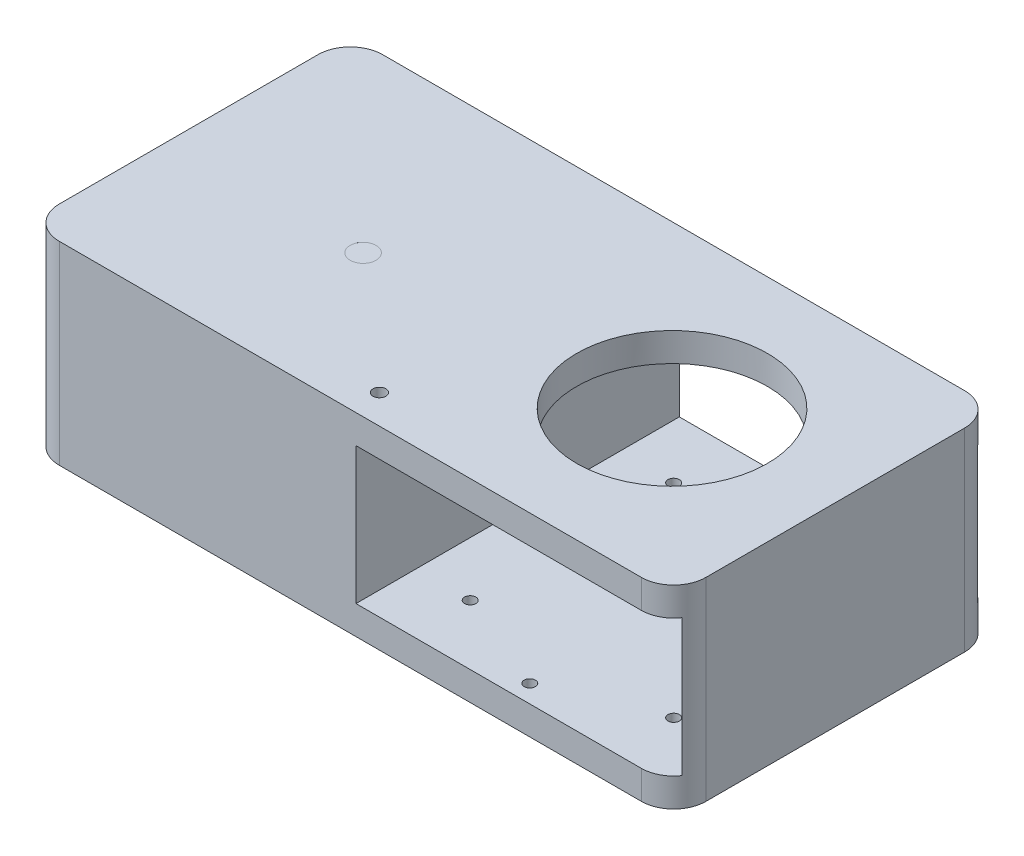
ISO-10303-21;
HEADER;
FILE_DESCRIPTION(('STEP AP214'),'2;1');
FILE_NAME('part.step','',(''),(''),'','','');
FILE_SCHEMA(('AUTOMOTIVE_DESIGN { 1 0 10303 214 1 1 1 1 }'));
ENDSEC;
DATA;
#1=APPLICATION_CONTEXT('core data for automotive mechanical design processes');
#2=APPLICATION_PROTOCOL_DEFINITION('international standard','automotive_design',2000,#1);
#3=PRODUCT_CONTEXT('',#1,'mechanical');
#4=PRODUCT('Part','Part','',(#3));
#5=PRODUCT_RELATED_PRODUCT_CATEGORY('part','',(#4));
#6=PRODUCT_DEFINITION_FORMATION('','',#4);
#7=PRODUCT_DEFINITION_CONTEXT('part definition',#1,'design');
#8=PRODUCT_DEFINITION('design','',#6,#7);
#9=PRODUCT_DEFINITION_SHAPE('','',#8);
#10=(LENGTH_UNIT() NAMED_UNIT(*) SI_UNIT(.MILLI.,.METRE.));
#11=(NAMED_UNIT(*) PLANE_ANGLE_UNIT() SI_UNIT($,.RADIAN.));
#12=(NAMED_UNIT(*) SI_UNIT($,.STERADIAN.) SOLID_ANGLE_UNIT());
#13=UNCERTAINTY_MEASURE_WITH_UNIT(LENGTH_MEASURE(1.E-05),#10,'distance_accuracy_value','');
#14=(GEOMETRIC_REPRESENTATION_CONTEXT(3) GLOBAL_UNCERTAINTY_ASSIGNED_CONTEXT((#13)) GLOBAL_UNIT_ASSIGNED_CONTEXT((#10,
#11,#12)) REPRESENTATION_CONTEXT('',''));
#15=CARTESIAN_POINT('',(0.,0.,0.));
#16=DIRECTION('',(0.,0.,1.));
#17=DIRECTION('',(1.,0.,0.));
#18=AXIS2_PLACEMENT_3D('',#15,#16,#17);
#19=CARTESIAN_POINT('',(90.,60.,-40.));
#20=DIRECTION('',(0.,1.,0.));
#21=DIRECTION('',(0.,0.,1.));
#22=AXIS2_PLACEMENT_3D('',#19,#20,#21);
#23=CYLINDRICAL_SURFACE('',#22,10.);
#24=DIRECTION('',(0.,1.,0.));
#25=VECTOR('',#24,1.);
#26=CARTESIAN_POINT('',(100.,60.,-40.));
#27=LINE('',#26,#25);
#28=CARTESIAN_POINT('',(100.,0.,-40.));
#29=VERTEX_POINT('',#28);
#30=CARTESIAN_POINT('',(100.,60.,-40.));
#31=VERTEX_POINT('',#30);
#32=EDGE_CURVE('E248',#29,#31,#27,.T.);
#33=ORIENTED_EDGE('',*,*,#32,.F.);
#34=CARTESIAN_POINT('',(90.,0.,-40.));
#35=DIRECTION('',(0.,1.,0.));
#36=DIRECTION('',(0.,0.,1.));
#37=AXIS2_PLACEMENT_3D('',#34,#35,#36);
#38=CIRCLE('',#37,10.);
#39=CARTESIAN_POINT('',(90.,0.,-50.));
#40=VERTEX_POINT('',#39);
#41=EDGE_CURVE('E44',#40,#29,#38,.F.);
#42=ORIENTED_EDGE('',*,*,#41,.F.);
#43=DIRECTION('',(0.,1.,0.));
#44=VECTOR('',#43,1.);
#45=CARTESIAN_POINT('',(90.,60.,-50.));
#46=LINE('',#45,#44);
#47=CARTESIAN_POINT('',(90.,8.85,-50.));
#48=VERTEX_POINT('',#47);
#49=EDGE_CURVE('E251',#48,#40,#46,.F.);
#50=ORIENTED_EDGE('',*,*,#49,.F.);
#51=CARTESIAN_POINT('',(90.,8.85,-40.));
#52=DIRECTION('',(0.,-1.,0.));
#53=DIRECTION('',(0.,0.,-1.));
#54=AXIS2_PLACEMENT_3D('',#51,#52,#53);
#55=CIRCLE('',#54,10.);
#56=CARTESIAN_POINT('',(98.25,8.85,-45.6513272777287));
#57=VERTEX_POINT('',#56);
#58=EDGE_CURVE('E51',#57,#48,#55,.F.);
#59=ORIENTED_EDGE('',*,*,#58,.F.);
#60=DIRECTION('',(0.,1.,0.));
#61=VECTOR('',#60,1.);
#62=CARTESIAN_POINT('',(98.25,60.,-45.6513272777287));
#63=LINE('',#62,#61);
#64=CARTESIAN_POINT('',(98.25,51.15,-45.6513272777287));
#65=VERTEX_POINT('',#64);
#66=EDGE_CURVE('E55',#65,#57,#63,.F.);
#67=ORIENTED_EDGE('',*,*,#66,.F.);
#68=CARTESIAN_POINT('',(90.,51.15,-40.));
#69=DIRECTION('',(0.,-1.,0.));
#70=DIRECTION('',(0.,0.,-1.));
#71=AXIS2_PLACEMENT_3D('',#68,#69,#70);
#72=CIRCLE('',#71,10.);
#73=CARTESIAN_POINT('',(90.,51.15,-50.));
#74=VERTEX_POINT('',#73);
#75=EDGE_CURVE('E255',#74,#65,#72,.T.);
#76=ORIENTED_EDGE('',*,*,#75,.F.);
#77=DIRECTION('',(0.,1.,0.));
#78=VECTOR('',#77,1.);
#79=CARTESIAN_POINT('',(90.,60.,-50.));
#80=LINE('',#79,#78);
#81=CARTESIAN_POINT('',(90.,60.,-50.));
#82=VERTEX_POINT('',#81);
#83=EDGE_CURVE('E253',#82,#74,#80,.F.);
#84=ORIENTED_EDGE('',*,*,#83,.F.);
#85=CARTESIAN_POINT('',(90.,60.,-40.));
#86=DIRECTION('',(0.,1.,0.));
#87=DIRECTION('',(0.,0.,1.));
#88=AXIS2_PLACEMENT_3D('',#85,#86,#87);
#89=CIRCLE('',#88,10.);
#90=EDGE_CURVE('E11',#31,#82,#89,.T.);
#91=ORIENTED_EDGE('',*,*,#90,.F.);
#92=EDGE_LOOP('',(#33,#42,#50,#59,#67,#76,#84,#91));
#93=FACE_BOUND('',#92,.T.);
#94=ADVANCED_FACE('F37',(#93),#23,.T.);
#95=CARTESIAN_POINT('',(90.,60.,40.));
#96=DIRECTION('',(0.,1.,0.));
#97=DIRECTION('',(0.,0.,1.));
#98=AXIS2_PLACEMENT_3D('',#95,#96,#97);
#99=CYLINDRICAL_SURFACE('',#98,10.);
#100=DIRECTION('',(0.,1.,0.));
#101=VECTOR('',#100,1.);
#102=CARTESIAN_POINT('',(90.,60.,50.));
#103=LINE('',#102,#101);
#104=CARTESIAN_POINT('',(90.,0.,50.));
#105=VERTEX_POINT('',#104);
#106=CARTESIAN_POINT('',(90.,8.85,50.));
#107=VERTEX_POINT('',#106);
#108=EDGE_CURVE('E230',#105,#107,#103,.T.);
#109=ORIENTED_EDGE('',*,*,#108,.F.);
#110=CARTESIAN_POINT('',(90.,0.,40.));
#111=DIRECTION('',(0.,1.,0.));
#112=DIRECTION('',(0.,0.,1.));
#113=AXIS2_PLACEMENT_3D('',#110,#111,#112);
#114=CIRCLE('',#113,10.);
#115=CARTESIAN_POINT('',(100.,0.,40.));
#116=VERTEX_POINT('',#115);
#117=EDGE_CURVE('E244',#116,#105,#114,.F.);
#118=ORIENTED_EDGE('',*,*,#117,.F.);
#119=DIRECTION('',(0.,1.,0.));
#120=VECTOR('',#119,1.);
#121=CARTESIAN_POINT('',(100.,60.,40.));
#122=LINE('',#121,#120);
#123=CARTESIAN_POINT('',(100.,60.,40.));
#124=VERTEX_POINT('',#123);
#125=EDGE_CURVE('E241',#124,#116,#122,.F.);
#126=ORIENTED_EDGE('',*,*,#125,.F.);
#127=CARTESIAN_POINT('',(90.,60.,40.));
#128=DIRECTION('',(0.,1.,0.));
#129=DIRECTION('',(0.,0.,1.));
#130=AXIS2_PLACEMENT_3D('',#127,#128,#129);
#131=CIRCLE('',#130,10.);
#132=CARTESIAN_POINT('',(90.,60.,50.));
#133=VERTEX_POINT('',#132);
#134=EDGE_CURVE('E246',#133,#124,#131,.T.);
#135=ORIENTED_EDGE('',*,*,#134,.F.);
#136=DIRECTION('',(0.,1.,0.));
#137=VECTOR('',#136,1.);
#138=CARTESIAN_POINT('',(90.,60.,50.));
#139=LINE('',#138,#137);
#140=CARTESIAN_POINT('',(90.,51.15,50.));
#141=VERTEX_POINT('',#140);
#142=EDGE_CURVE('E227',#141,#133,#139,.T.);
#143=ORIENTED_EDGE('',*,*,#142,.F.);
#144=CARTESIAN_POINT('',(90.,51.15,40.));
#145=DIRECTION('',(0.,-1.,0.));
#146=DIRECTION('',(0.,0.,-1.));
#147=AXIS2_PLACEMENT_3D('',#144,#145,#146);
#148=CIRCLE('',#147,10.);
#149=CARTESIAN_POINT('',(98.25,51.15,45.6513272777287));
#150=VERTEX_POINT('',#149);
#151=EDGE_CURVE('E239',#150,#141,#148,.T.);
#152=ORIENTED_EDGE('',*,*,#151,.F.);
#153=DIRECTION('',(0.,1.,0.));
#154=VECTOR('',#153,1.);
#155=CARTESIAN_POINT('',(98.25,60.,45.6513272777287));
#156=LINE('',#155,#154);
#157=CARTESIAN_POINT('',(98.25,8.85,45.6513272777287));
#158=VERTEX_POINT('',#157);
#159=EDGE_CURVE('E236',#158,#150,#156,.T.);
#160=ORIENTED_EDGE('',*,*,#159,.F.);
#161=CARTESIAN_POINT('',(90.,8.85,40.));
#162=DIRECTION('',(0.,-1.,0.));
#163=DIRECTION('',(0.,0.,-1.));
#164=AXIS2_PLACEMENT_3D('',#161,#162,#163);
#165=CIRCLE('',#164,10.);
#166=EDGE_CURVE('E233',#107,#158,#165,.F.);
#167=ORIENTED_EDGE('',*,*,#166,.F.);
#168=EDGE_LOOP('',(#109,#118,#126,#135,#143,#152,#160,#167));
#169=FACE_BOUND('',#168,.T.);
#170=ADVANCED_FACE('F270',(#169),#99,.T.);
#171=CARTESIAN_POINT('',(-90.,60.,40.));
#172=DIRECTION('',(0.,1.,0.));
#173=DIRECTION('',(0.,0.,1.));
#174=AXIS2_PLACEMENT_3D('',#171,#172,#173);
#175=CYLINDRICAL_SURFACE('',#174,10.);
#176=DIRECTION('',(0.,1.,0.));
#177=VECTOR('',#176,1.);
#178=CARTESIAN_POINT('',(-100.,60.,40.));
#179=LINE('',#178,#177);
#180=CARTESIAN_POINT('',(-100.,0.,40.));
#181=VERTEX_POINT('',#180);
#182=CARTESIAN_POINT('',(-100.,60.,40.));
#183=VERTEX_POINT('',#182);
#184=EDGE_CURVE('E217',#181,#183,#179,.T.);
#185=ORIENTED_EDGE('',*,*,#184,.F.);
#186=CARTESIAN_POINT('',(-90.,0.,40.));
#187=DIRECTION('',(0.,1.,0.));
#188=DIRECTION('',(0.,0.,1.));
#189=AXIS2_PLACEMENT_3D('',#186,#187,#188);
#190=CIRCLE('',#189,10.);
#191=CARTESIAN_POINT('',(-90.,0.,50.));
#192=VERTEX_POINT('',#191);
#193=EDGE_CURVE('E223',#192,#181,#190,.F.);
#194=ORIENTED_EDGE('',*,*,#193,.F.);
#195=DIRECTION('',(0.,1.,0.));
#196=VECTOR('',#195,1.);
#197=CARTESIAN_POINT('',(-90.,60.,50.));
#198=LINE('',#197,#196);
#199=CARTESIAN_POINT('',(-90.,60.,50.));
#200=VERTEX_POINT('',#199);
#201=EDGE_CURVE('E220',#200,#192,#198,.F.);
#202=ORIENTED_EDGE('',*,*,#201,.F.);
#203=CARTESIAN_POINT('',(-90.,60.,40.));
#204=DIRECTION('',(0.,1.,0.));
#205=DIRECTION('',(0.,0.,1.));
#206=AXIS2_PLACEMENT_3D('',#203,#204,#205);
#207=CIRCLE('',#206,10.);
#208=EDGE_CURVE('E225',#183,#200,#207,.T.);
#209=ORIENTED_EDGE('',*,*,#208,.F.);
#210=EDGE_LOOP('',(#185,#194,#202,#209));
#211=FACE_BOUND('',#210,.T.);
#212=ADVANCED_FACE('F280',(#211),#175,.T.);
#213=CARTESIAN_POINT('',(-90.,60.,-40.));
#214=DIRECTION('',(0.,1.,0.));
#215=DIRECTION('',(0.,0.,1.));
#216=AXIS2_PLACEMENT_3D('',#213,#214,#215);
#217=CYLINDRICAL_SURFACE('',#216,10.);
#218=DIRECTION('',(0.,1.,0.));
#219=VECTOR('',#218,1.);
#220=CARTESIAN_POINT('',(-90.,60.,-50.));
#221=LINE('',#220,#219);
#222=CARTESIAN_POINT('',(-90.,0.,-50.));
#223=VERTEX_POINT('',#222);
#224=CARTESIAN_POINT('',(-90.,60.,-50.));
#225=VERTEX_POINT('',#224);
#226=EDGE_CURVE('E201',#223,#225,#221,.T.);
#227=ORIENTED_EDGE('',*,*,#226,.F.);
#228=CARTESIAN_POINT('',(-90.,0.,-40.));
#229=DIRECTION('',(0.,1.,0.));
#230=DIRECTION('',(0.,0.,1.));
#231=AXIS2_PLACEMENT_3D('',#228,#229,#230);
#232=CIRCLE('',#231,10.);
#233=CARTESIAN_POINT('',(-100.,0.,-40.));
#234=VERTEX_POINT('',#233);
#235=EDGE_CURVE('E212',#234,#223,#232,.F.);
#236=ORIENTED_EDGE('',*,*,#235,.F.);
#237=DIRECTION('',(0.,1.,0.));
#238=VECTOR('',#237,1.);
#239=CARTESIAN_POINT('',(-100.,60.,-40.));
#240=LINE('',#239,#238);
#241=CARTESIAN_POINT('',(-100.,60.,-40.));
#242=VERTEX_POINT('',#241);
#243=EDGE_CURVE('E209',#242,#234,#240,.F.);
#244=ORIENTED_EDGE('',*,*,#243,.F.);
#245=CARTESIAN_POINT('',(-90.,60.,-40.));
#246=DIRECTION('',(0.,1.,0.));
#247=DIRECTION('',(0.,0.,1.));
#248=AXIS2_PLACEMENT_3D('',#245,#246,#247);
#249=CIRCLE('',#248,10.);
#250=EDGE_CURVE('E215',#225,#242,#249,.T.);
#251=ORIENTED_EDGE('',*,*,#250,.F.);
#252=EDGE_LOOP('',(#227,#236,#244,#251));
#253=FACE_BOUND('',#252,.T.);
#254=ADVANCED_FACE('F288',(#253),#217,.T.);
#255=CARTESIAN_POINT('',(-100.,60.,-50.));
#256=DIRECTION('',(0.,0.,1.));
#257=DIRECTION('',(1.,0.,0.));
#258=AXIS2_PLACEMENT_3D('',#255,#256,#257);
#259=PLANE('',#258);
#260=CARTESIAN_POINT('',(0.,30.,-50.));
#261=DIRECTION('',(0.,0.,-1.));
#262=DIRECTION('',(-1.,0.,0.));
#263=AXIS2_PLACEMENT_3D('',#260,#261,#262);
#264=CIRCLE('',#263,1.);
#265=CARTESIAN_POINT('',(-1.00000000000003,30.,-50.));
#266=VERTEX_POINT('',#265);
#267=EDGE_CURVE('E205',#266,#266,#264,.T.);
#268=ORIENTED_EDGE('',*,*,#267,.F.);
#269=EDGE_LOOP('',(#268));
#270=FACE_BOUND('',#269,.T.);
#271=DIRECTION('',(-1.,0.,0.));
#272=VECTOR('',#271,1.);
#273=CARTESIAN_POINT('',(-100.,60.,-50.));
#274=LINE('',#273,#272);
#275=EDGE_CURVE('E178',#82,#225,#274,.T.);
#276=ORIENTED_EDGE('',*,*,#275,.F.);
#277=ORIENTED_EDGE('',*,*,#83,.T.);
#278=DIRECTION('',(-1.,0.,0.));
#279=VECTOR('',#278,1.);
#280=CARTESIAN_POINT('',(0.,51.15,-50.));
#281=LINE('',#280,#279);
#282=CARTESIAN_POINT('',(1.74999999999997,51.15,-50.));
#283=VERTEX_POINT('',#282);
#284=EDGE_CURVE('E144',#74,#283,#281,.T.);
#285=ORIENTED_EDGE('',*,*,#284,.T.);
#286=DIRECTION('',(0.,-1.,0.));
#287=VECTOR('',#286,1.);
#288=CARTESIAN_POINT('',(1.74999999999997,0.,-50.));
#289=LINE('',#288,#287);
#290=CARTESIAN_POINT('',(1.74999999999997,8.85,-50.));
#291=VERTEX_POINT('',#290);
#292=EDGE_CURVE('E151',#283,#291,#289,.T.);
#293=ORIENTED_EDGE('',*,*,#292,.T.);
#294=DIRECTION('',(-1.,0.,0.));
#295=VECTOR('',#294,1.);
#296=CARTESIAN_POINT('',(0.,8.85,-50.));
#297=LINE('',#296,#295);
#298=EDGE_CURVE('E134',#48,#291,#297,.T.);
#299=ORIENTED_EDGE('',*,*,#298,.F.);
#300=ORIENTED_EDGE('',*,*,#49,.T.);
#301=DIRECTION('',(-1.,0.,0.));
#302=VECTOR('',#301,1.);
#303=CARTESIAN_POINT('',(-100.,0.,-50.));
#304=LINE('',#303,#302);
#305=EDGE_CURVE('E190',#40,#223,#304,.T.);
#306=ORIENTED_EDGE('',*,*,#305,.T.);
#307=ORIENTED_EDGE('',*,*,#226,.T.);
#308=EDGE_LOOP('',(#276,#277,#285,#293,#299,#300,#306,#307));
#309=FACE_BOUND('',#308,.T.);
#310=ADVANCED_FACE('F159',(#270,#309),#259,.F.);
#311=CARTESIAN_POINT('',(-100.,60.,50.));
#312=DIRECTION('',(0.,0.,-1.));
#313=DIRECTION('',(-1.,0.,0.));
#314=AXIS2_PLACEMENT_3D('',#311,#312,#313);
#315=PLANE('',#314);
#316=DIRECTION('',(1.,0.,0.));
#317=VECTOR('',#316,1.);
#318=CARTESIAN_POINT('',(-100.,0.,50.));
#319=LINE('',#318,#317);
#320=EDGE_CURVE('E179',#192,#105,#319,.T.);
#321=ORIENTED_EDGE('',*,*,#320,.T.);
#322=ORIENTED_EDGE('',*,*,#108,.T.);
#323=DIRECTION('',(-1.,0.,0.));
#324=VECTOR('',#323,1.);
#325=CARTESIAN_POINT('',(-100.,8.85,50.));
#326=LINE('',#325,#324);
#327=CARTESIAN_POINT('',(1.74999999999997,8.85,50.));
#328=VERTEX_POINT('',#327);
#329=EDGE_CURVE('E198',#107,#328,#326,.T.);
#330=ORIENTED_EDGE('',*,*,#329,.T.);
#331=DIRECTION('',(0.,-1.,0.));
#332=VECTOR('',#331,1.);
#333=CARTESIAN_POINT('',(1.74999999999997,60.,50.));
#334=LINE('',#333,#332);
#335=CARTESIAN_POINT('',(1.74999999999997,51.15,50.));
#336=VERTEX_POINT('',#335);
#337=EDGE_CURVE('E154',#336,#328,#334,.T.);
#338=ORIENTED_EDGE('',*,*,#337,.F.);
#339=DIRECTION('',(-1.,0.,0.));
#340=VECTOR('',#339,1.);
#341=CARTESIAN_POINT('',(-100.,51.15,50.));
#342=LINE('',#341,#340);
#343=EDGE_CURVE('E187',#141,#336,#342,.T.);
#344=ORIENTED_EDGE('',*,*,#343,.F.);
#345=ORIENTED_EDGE('',*,*,#142,.T.);
#346=DIRECTION('',(1.,0.,0.));
#347=VECTOR('',#346,1.);
#348=CARTESIAN_POINT('',(-100.,60.,50.));
#349=LINE('',#348,#347);
#350=EDGE_CURVE('E184',#200,#133,#349,.T.);
#351=ORIENTED_EDGE('',*,*,#350,.F.);
#352=ORIENTED_EDGE('',*,*,#201,.T.);
#353=EDGE_LOOP('',(#321,#322,#330,#338,#344,#345,#351,#352));
#354=FACE_BOUND('',#353,.T.);
#355=ADVANCED_FACE('F276',(#354),#315,.F.);
#356=CARTESIAN_POINT('',(100.,60.,-50.));
#357=DIRECTION('',(-1.,0.,0.));
#358=DIRECTION('',(0.,0.,1.));
#359=AXIS2_PLACEMENT_3D('',#356,#357,#358);
#360=PLANE('',#359);
#361=DIRECTION('',(0.,0.,-1.));
#362=VECTOR('',#361,1.);
#363=CARTESIAN_POINT('',(100.,0.,-50.));
#364=LINE('',#363,#362);
#365=EDGE_CURVE('E155',#116,#29,#364,.T.);
#366=ORIENTED_EDGE('',*,*,#365,.T.);
#367=ORIENTED_EDGE('',*,*,#32,.T.);
#368=DIRECTION('',(0.,0.,-1.));
#369=VECTOR('',#368,1.);
#370=CARTESIAN_POINT('',(100.,60.,-50.));
#371=LINE('',#370,#369);
#372=EDGE_CURVE('E175',#124,#31,#371,.T.);
#373=ORIENTED_EDGE('',*,*,#372,.F.);
#374=ORIENTED_EDGE('',*,*,#125,.T.);
#375=EDGE_LOOP('',(#366,#367,#373,#374));
#376=FACE_BOUND('',#375,.T.);
#377=ADVANCED_FACE('F266',(#376),#360,.F.);
#378=CARTESIAN_POINT('',(-100.,60.,-50.));
#379=DIRECTION('',(1.,0.,0.));
#380=DIRECTION('',(0.,0.,-1.));
#381=AXIS2_PLACEMENT_3D('',#378,#379,#380);
#382=PLANE('',#381);
#383=DIRECTION('',(0.,0.,1.));
#384=VECTOR('',#383,1.);
#385=CARTESIAN_POINT('',(-100.,0.,-50.));
#386=LINE('',#385,#384);
#387=EDGE_CURVE('E192',#234,#181,#386,.T.);
#388=ORIENTED_EDGE('',*,*,#387,.T.);
#389=ORIENTED_EDGE('',*,*,#184,.T.);
#390=DIRECTION('',(0.,0.,1.));
#391=VECTOR('',#390,1.);
#392=CARTESIAN_POINT('',(-100.,60.,-50.));
#393=LINE('',#392,#391);
#394=EDGE_CURVE('E181',#242,#183,#393,.T.);
#395=ORIENTED_EDGE('',*,*,#394,.F.);
#396=ORIENTED_EDGE('',*,*,#243,.T.);
#397=EDGE_LOOP('',(#388,#389,#395,#396));
#398=FACE_BOUND('',#397,.T.);
#399=ADVANCED_FACE('F283',(#398),#382,.F.);
#400=CARTESIAN_POINT('',(0.,60.,0.));
#401=DIRECTION('',(0.,1.,0.));
#402=DIRECTION('',(0.,0.,1.));
#403=AXIS2_PLACEMENT_3D('',#400,#401,#402);
#404=PLANE('',#403);
#405=CARTESIAN_POINT('',(-39.9437715332075,60.,6.11506949070184));
#406=DIRECTION('',(0.,1.,0.));
#407=DIRECTION('',(0.,0.,1.));
#408=AXIS2_PLACEMENT_3D('',#405,#406,#407);
#409=CIRCLE('',#408,4.0000000018226);
#410=CARTESIAN_POINT('',(-39.9437715332075,60.,10.1150694925244));
#411=VERTEX_POINT('',#410);
#412=EDGE_CURVE('E625',#411,#411,#409,.T.);
#413=ORIENTED_EDGE('',*,*,#412,.F.);
#414=EDGE_LOOP('',(#413));
#415=FACE_BOUND('',#414,.T.);
#416=CARTESIAN_POINT('',(49.5007658400405,60.,0.));
#417=DIRECTION('',(0.,1.,0.));
#418=DIRECTION('',(0.,0.,1.));
#419=AXIS2_PLACEMENT_3D('',#416,#417,#418);
#420=CIRCLE('',#419,29.5);
#421=CARTESIAN_POINT('',(49.5007658400405,60.,29.5));
#422=VERTEX_POINT('',#421);
#423=EDGE_CURVE('E206',#422,#422,#420,.T.);
#424=ORIENTED_EDGE('',*,*,#423,.F.);
#425=EDGE_LOOP('',(#424));
#426=FACE_BOUND('',#425,.T.);
#427=CARTESIAN_POINT('',(0.,60.,41.));
#428=DIRECTION('',(0.,1.,0.));
#429=DIRECTION('',(0.,0.,1.));
#430=AXIS2_PLACEMENT_3D('',#427,#428,#429);
#431=CIRCLE('',#430,2.);
#432=CARTESIAN_POINT('',(0.,60.,43.));
#433=VERTEX_POINT('',#432);
#434=EDGE_CURVE('E166',#433,#433,#431,.T.);
#435=ORIENTED_EDGE('',*,*,#434,.F.);
#436=EDGE_LOOP('',(#435));
#437=FACE_BOUND('',#436,.T.);
#438=ORIENTED_EDGE('',*,*,#372,.T.);
#439=ORIENTED_EDGE('',*,*,#90,.T.);
#440=ORIENTED_EDGE('',*,*,#275,.T.);
#441=ORIENTED_EDGE('',*,*,#250,.T.);
#442=ORIENTED_EDGE('',*,*,#394,.T.);
#443=ORIENTED_EDGE('',*,*,#208,.T.);
#444=ORIENTED_EDGE('',*,*,#350,.T.);
#445=ORIENTED_EDGE('',*,*,#134,.T.);
#446=EDGE_LOOP('',(#438,#439,#440,#441,#442,#443,#444,#445));
#447=FACE_BOUND('',#446,.T.);
#448=ADVANCED_FACE('F290',(#415,#426,#437,#447),#404,.T.);
#449=CARTESIAN_POINT('',(0.,0.,0.));
#450=DIRECTION('',(0.,1.,0.));
#451=DIRECTION('',(0.,0.,1.));
#452=AXIS2_PLACEMENT_3D('',#449,#450,#451);
#453=PLANE('',#452);
#454=CARTESIAN_POINT('',(50.,0.,44.5));
#455=DIRECTION('',(0.,1.,0.));
#456=DIRECTION('',(0.,0.,1.));
#457=AXIS2_PLACEMENT_3D('',#454,#455,#456);
#458=CIRCLE('',#457,1.75);
#459=CARTESIAN_POINT('',(50.,0.,46.25));
#460=VERTEX_POINT('',#459);
#461=EDGE_CURVE('E674',#460,#460,#458,.T.);
#462=ORIENTED_EDGE('',*,*,#461,.T.);
#463=EDGE_LOOP('',(#462));
#464=FACE_BOUND('',#463,.T.);
#465=CARTESIAN_POINT('',(18.5337482371985,0.,31.4662517628013));
#466=DIRECTION('',(0.,1.,0.));
#467=DIRECTION('',(0.,0.,1.));
#468=AXIS2_PLACEMENT_3D('',#465,#466,#467);
#469=CIRCLE('',#468,1.75);
#470=CARTESIAN_POINT('',(18.5337482371985,0.,33.2162517628013));
#471=VERTEX_POINT('',#470);
#472=EDGE_CURVE('E671',#471,#471,#469,.T.);
#473=ORIENTED_EDGE('',*,*,#472,.T.);
#474=EDGE_LOOP('',(#473));
#475=FACE_BOUND('',#474,.T.);
#476=CARTESIAN_POINT('',(5.49999999999998,0.,-1.59594559789866E-13));
#477=DIRECTION('',(0.,1.,0.));
#478=DIRECTION('',(0.,0.,1.));
#479=AXIS2_PLACEMENT_3D('',#476,#477,#478);
#480=CIRCLE('',#479,1.75);
#481=CARTESIAN_POINT('',(5.49999999999998,0.,1.74999999999984));
#482=VERTEX_POINT('',#481);
#483=EDGE_CURVE('E668',#482,#482,#480,.T.);
#484=ORIENTED_EDGE('',*,*,#483,.T.);
#485=EDGE_LOOP('',(#484));
#486=FACE_BOUND('',#485,.T.);
#487=CARTESIAN_POINT('',(18.5337482371988,0.,-31.4662517628015));
#488=DIRECTION('',(0.,1.,0.));
#489=DIRECTION('',(0.,0.,1.));
#490=AXIS2_PLACEMENT_3D('',#487,#488,#489);
#491=CIRCLE('',#490,1.75000000000001);
#492=CARTESIAN_POINT('',(18.5337482371988,0.,-29.7162517628015));
#493=VERTEX_POINT('',#492);
#494=EDGE_CURVE('E665',#493,#493,#491,.T.);
#495=ORIENTED_EDGE('',*,*,#494,.T.);
#496=EDGE_LOOP('',(#495));
#497=FACE_BOUND('',#496,.T.);
#498=CARTESIAN_POINT('',(50.0000000000003,0.,-44.5));
#499=DIRECTION('',(0.,1.,0.));
#500=DIRECTION('',(0.,0.,1.));
#501=AXIS2_PLACEMENT_3D('',#498,#499,#500);
#502=CIRCLE('',#501,1.75000000000001);
#503=CARTESIAN_POINT('',(50.0000000000003,0.,-42.75));
#504=VERTEX_POINT('',#503);
#505=EDGE_CURVE('E662',#504,#504,#502,.T.);
#506=ORIENTED_EDGE('',*,*,#505,.T.);
#507=EDGE_LOOP('',(#506));
#508=FACE_BOUND('',#507,.T.);
#509=CARTESIAN_POINT('',(81.4662517628016,0.,-31.4662517628011));
#510=DIRECTION('',(0.,1.,0.));
#511=DIRECTION('',(0.,0.,1.));
#512=AXIS2_PLACEMENT_3D('',#509,#510,#511);
#513=CIRCLE('',#512,1.75000000000001);
#514=CARTESIAN_POINT('',(81.4662517628016,0.,-29.7162517628011));
#515=VERTEX_POINT('',#514);
#516=EDGE_CURVE('E659',#515,#515,#513,.T.);
#517=ORIENTED_EDGE('',*,*,#516,.T.);
#518=EDGE_LOOP('',(#517));
#519=FACE_BOUND('',#518,.T.);
#520=CARTESIAN_POINT('',(94.5,0.,4.71844785465692E-13));
#521=DIRECTION('',(0.,1.,0.));
#522=DIRECTION('',(0.,0.,1.));
#523=AXIS2_PLACEMENT_3D('',#520,#521,#522);
#524=CIRCLE('',#523,1.75000000000001);
#525=CARTESIAN_POINT('',(94.5,0.,1.75000000000048));
#526=VERTEX_POINT('',#525);
#527=EDGE_CURVE('E656',#526,#526,#524,.T.);
#528=ORIENTED_EDGE('',*,*,#527,.T.);
#529=EDGE_LOOP('',(#528));
#530=FACE_BOUND('',#529,.T.);
#531=CARTESIAN_POINT('',(81.466251762801,0.,31.4662517628018));
#532=DIRECTION('',(0.,1.,0.));
#533=DIRECTION('',(0.,0.,1.));
#534=AXIS2_PLACEMENT_3D('',#531,#532,#533);
#535=CIRCLE('',#534,1.75000000000001);
#536=CARTESIAN_POINT('',(81.466251762801,0.,33.2162517628018));
#537=VERTEX_POINT('',#536);
#538=EDGE_CURVE('E636',#537,#537,#535,.T.);
#539=ORIENTED_EDGE('',*,*,#538,.T.);
#540=EDGE_LOOP('',(#539));
#541=FACE_BOUND('',#540,.T.);
#542=ORIENTED_EDGE('',*,*,#305,.F.);
#543=ORIENTED_EDGE('',*,*,#41,.T.);
#544=ORIENTED_EDGE('',*,*,#365,.F.);
#545=ORIENTED_EDGE('',*,*,#117,.T.);
#546=ORIENTED_EDGE('',*,*,#320,.F.);
#547=ORIENTED_EDGE('',*,*,#193,.T.);
#548=ORIENTED_EDGE('',*,*,#387,.F.);
#549=ORIENTED_EDGE('',*,*,#235,.T.);
#550=EDGE_LOOP('',(#542,#543,#544,#545,#546,#547,#548,#549));
#551=FACE_BOUND('',#550,.T.);
#552=ADVANCED_FACE('F262',(#464,#475,#486,#497,#508,#519,#530,#541,#551),#453,.F.);
#553=CARTESIAN_POINT('',(1.74999999999997,0.,130.));
#554=DIRECTION('',(1.,0.,0.));
#555=DIRECTION('',(0.,0.,-1.));
#556=AXIS2_PLACEMENT_3D('',#553,#554,#555);
#557=PLANE('',#556);
#558=ORIENTED_EDGE('',*,*,#337,.T.);
#559=DIRECTION('',(0.,0.,-1.));
#560=VECTOR('',#559,1.);
#561=CARTESIAN_POINT('',(1.74999999999997,8.85,130.));
#562=LINE('',#561,#560);
#563=EDGE_CURVE('E139',#328,#291,#562,.T.);
#564=ORIENTED_EDGE('',*,*,#563,.T.);
#565=ORIENTED_EDGE('',*,*,#292,.F.);
#566=DIRECTION('',(0.,0.,-1.));
#567=VECTOR('',#566,1.);
#568=CARTESIAN_POINT('',(1.74999999999997,51.15,130.));
#569=LINE('',#568,#567);
#570=EDGE_CURVE('E143',#336,#283,#569,.T.);
#571=ORIENTED_EDGE('',*,*,#570,.F.);
#572=EDGE_LOOP('',(#558,#564,#565,#571));
#573=FACE_BOUND('',#572,.T.);
#574=ADVANCED_FACE('F149',(#573),#557,.T.);
#575=CARTESIAN_POINT('',(0.,8.85,130.));
#576=DIRECTION('',(0.,-1.,0.));
#577=DIRECTION('',(0.,0.,-1.));
#578=AXIS2_PLACEMENT_3D('',#575,#576,#577);
#579=PLANE('',#578);
#580=CARTESIAN_POINT('',(50.,8.85,44.5));
#581=DIRECTION('',(0.,1.,0.));
#582=DIRECTION('',(0.,0.,1.));
#583=AXIS2_PLACEMENT_3D('',#580,#581,#582);
#584=CIRCLE('',#583,1.75);
#585=CARTESIAN_POINT('',(50.,8.85,46.25));
#586=VERTEX_POINT('',#585);
#587=EDGE_CURVE('E633',#586,#586,#584,.T.);
#588=ORIENTED_EDGE('',*,*,#587,.F.);
#589=EDGE_LOOP('',(#588));
#590=FACE_BOUND('',#589,.T.);
#591=CARTESIAN_POINT('',(18.5337482371985,8.85,31.4662517628013));
#592=DIRECTION('',(0.,1.,0.));
#593=DIRECTION('',(0.,0.,1.));
#594=AXIS2_PLACEMENT_3D('',#591,#592,#593);
#595=CIRCLE('',#594,1.75);
#596=CARTESIAN_POINT('',(18.5337482371985,8.85,33.2162517628013));
#597=VERTEX_POINT('',#596);
#598=EDGE_CURVE('E637',#597,#597,#595,.T.);
#599=ORIENTED_EDGE('',*,*,#598,.F.);
#600=EDGE_LOOP('',(#599));
#601=FACE_BOUND('',#600,.T.);
#602=CARTESIAN_POINT('',(5.49999999999998,8.85,-1.59594559789866E-13));
#603=DIRECTION('',(0.,1.,0.));
#604=DIRECTION('',(0.,0.,1.));
#605=AXIS2_PLACEMENT_3D('',#602,#603,#604);
#606=CIRCLE('',#605,1.75);
#607=CARTESIAN_POINT('',(5.49999999999998,8.85,1.74999999999984));
#608=VERTEX_POINT('',#607);
#609=EDGE_CURVE('E640',#608,#608,#606,.T.);
#610=ORIENTED_EDGE('',*,*,#609,.F.);
#611=EDGE_LOOP('',(#610));
#612=FACE_BOUND('',#611,.T.);
#613=CARTESIAN_POINT('',(18.5337482371988,8.85,-31.4662517628015));
#614=DIRECTION('',(0.,1.,0.));
#615=DIRECTION('',(0.,0.,1.));
#616=AXIS2_PLACEMENT_3D('',#613,#614,#615);
#617=CIRCLE('',#616,1.75000000000001);
#618=CARTESIAN_POINT('',(18.5337482371988,8.85,-29.7162517628015));
#619=VERTEX_POINT('',#618);
#620=EDGE_CURVE('E643',#619,#619,#617,.T.);
#621=ORIENTED_EDGE('',*,*,#620,.F.);
#622=EDGE_LOOP('',(#621));
#623=FACE_BOUND('',#622,.T.);
#624=CARTESIAN_POINT('',(50.0000000000003,8.85,-44.5));
#625=DIRECTION('',(0.,1.,0.));
#626=DIRECTION('',(0.,0.,1.));
#627=AXIS2_PLACEMENT_3D('',#624,#625,#626);
#628=CIRCLE('',#627,1.75000000000001);
#629=CARTESIAN_POINT('',(50.0000000000003,8.85,-42.75));
#630=VERTEX_POINT('',#629);
#631=EDGE_CURVE('E646',#630,#630,#628,.T.);
#632=ORIENTED_EDGE('',*,*,#631,.F.);
#633=EDGE_LOOP('',(#632));
#634=FACE_BOUND('',#633,.T.);
#635=CARTESIAN_POINT('',(81.4662517628016,8.85,-31.4662517628011));
#636=DIRECTION('',(0.,1.,0.));
#637=DIRECTION('',(0.,0.,1.));
#638=AXIS2_PLACEMENT_3D('',#635,#636,#637);
#639=CIRCLE('',#638,1.75000000000001);
#640=CARTESIAN_POINT('',(81.4662517628016,8.85,-29.7162517628011));
#641=VERTEX_POINT('',#640);
#642=EDGE_CURVE('E649',#641,#641,#639,.T.);
#643=ORIENTED_EDGE('',*,*,#642,.F.);
#644=EDGE_LOOP('',(#643));
#645=FACE_BOUND('',#644,.T.);
#646=CARTESIAN_POINT('',(94.5,8.85,4.71844785465692E-13));
#647=DIRECTION('',(0.,1.,0.));
#648=DIRECTION('',(0.,0.,1.));
#649=AXIS2_PLACEMENT_3D('',#646,#647,#648);
#650=CIRCLE('',#649,1.75000000000001);
#651=CARTESIAN_POINT('',(94.5,8.85,1.75000000000048));
#652=VERTEX_POINT('',#651);
#653=EDGE_CURVE('E628',#652,#652,#650,.T.);
#654=ORIENTED_EDGE('',*,*,#653,.F.);
#655=EDGE_LOOP('',(#654));
#656=FACE_BOUND('',#655,.T.);
#657=CARTESIAN_POINT('',(81.466251762801,8.85,31.4662517628018));
#658=DIRECTION('',(0.,1.,0.));
#659=DIRECTION('',(0.,0.,1.));
#660=AXIS2_PLACEMENT_3D('',#657,#658,#659);
#661=CIRCLE('',#660,1.75000000000001);
#662=CARTESIAN_POINT('',(81.466251762801,8.85,33.2162517628018));
#663=VERTEX_POINT('',#662);
#664=EDGE_CURVE('E624',#663,#663,#661,.T.);
#665=ORIENTED_EDGE('',*,*,#664,.F.);
#666=EDGE_LOOP('',(#665));
#667=FACE_BOUND('',#666,.T.);
#668=DIRECTION('',(0.,0.,-1.));
#669=VECTOR('',#668,1.);
#670=CARTESIAN_POINT('',(98.25,8.85,130.));
#671=LINE('',#670,#669);
#672=EDGE_CURVE('E156',#158,#57,#671,.T.);
#673=ORIENTED_EDGE('',*,*,#672,.T.);
#674=ORIENTED_EDGE('',*,*,#58,.T.);
#675=ORIENTED_EDGE('',*,*,#298,.T.);
#676=ORIENTED_EDGE('',*,*,#563,.F.);
#677=ORIENTED_EDGE('',*,*,#329,.F.);
#678=ORIENTED_EDGE('',*,*,#166,.T.);
#679=EDGE_LOOP('',(#673,#674,#675,#676,#677,#678));
#680=FACE_BOUND('',#679,.T.);
#681=ADVANCED_FACE('F137',(#590,#601,#612,#623,#634,#645,#656,#667,#680),#579,.F.);
#682=CARTESIAN_POINT('',(98.25,0.,130.));
#683=DIRECTION('',(1.,0.,0.));
#684=DIRECTION('',(0.,0.,-1.));
#685=AXIS2_PLACEMENT_3D('',#682,#683,#684);
#686=PLANE('',#685);
#687=DIRECTION('',(0.,0.,-1.));
#688=VECTOR('',#687,1.);
#689=CARTESIAN_POINT('',(98.25,51.15,130.));
#690=LINE('',#689,#688);
#691=EDGE_CURVE('E171',#150,#65,#690,.T.);
#692=ORIENTED_EDGE('',*,*,#691,.T.);
#693=ORIENTED_EDGE('',*,*,#66,.T.);
#694=ORIENTED_EDGE('',*,*,#672,.F.);
#695=ORIENTED_EDGE('',*,*,#159,.T.);
#696=EDGE_LOOP('',(#692,#693,#694,#695));
#697=FACE_BOUND('',#696,.T.);
#698=ADVANCED_FACE('F295',(#697),#686,.F.);
#699=CARTESIAN_POINT('',(0.,51.15,130.));
#700=DIRECTION('',(0.,-1.,0.));
#701=DIRECTION('',(0.,0.,-1.));
#702=AXIS2_PLACEMENT_3D('',#699,#700,#701);
#703=PLANE('',#702);
#704=CARTESIAN_POINT('',(49.5007658400405,51.15,0.));
#705=DIRECTION('',(0.,-1.,0.));
#706=DIRECTION('',(0.,0.,-1.));
#707=AXIS2_PLACEMENT_3D('',#704,#705,#706);
#708=CIRCLE('',#707,29.5);
#709=CARTESIAN_POINT('',(49.5007658400405,51.15,-29.5));
#710=VERTEX_POINT('',#709);
#711=EDGE_CURVE('E202',#710,#710,#708,.T.);
#712=ORIENTED_EDGE('',*,*,#711,.F.);
#713=EDGE_LOOP('',(#712));
#714=FACE_BOUND('',#713,.T.);
#715=ORIENTED_EDGE('',*,*,#284,.F.);
#716=ORIENTED_EDGE('',*,*,#75,.T.);
#717=ORIENTED_EDGE('',*,*,#691,.F.);
#718=ORIENTED_EDGE('',*,*,#151,.T.);
#719=ORIENTED_EDGE('',*,*,#343,.T.);
#720=ORIENTED_EDGE('',*,*,#570,.T.);
#721=EDGE_LOOP('',(#715,#716,#717,#718,#719,#720));
#722=FACE_BOUND('',#721,.T.);
#723=ADVANCED_FACE('F293',(#714,#722),#703,.T.);
#724=CARTESIAN_POINT('',(0.,57.,41.));
#725=DIRECTION('',(0.,1.,0.));
#726=DIRECTION('',(0.,0.,1.));
#727=AXIS2_PLACEMENT_3D('',#724,#725,#726);
#728=CYLINDRICAL_SURFACE('',#727,2.);
#729=CARTESIAN_POINT('',(0.,57.,41.));
#730=DIRECTION('',(0.,1.,0.));
#731=DIRECTION('',(0.,0.,1.));
#732=AXIS2_PLACEMENT_3D('',#729,#730,#731);
#733=CIRCLE('',#732,2.);
#734=CARTESIAN_POINT('',(0.,57.,43.));
#735=VERTEX_POINT('',#734);
#736=EDGE_CURVE('E162',#735,#735,#733,.T.);
#737=ORIENTED_EDGE('',*,*,#736,.F.);
#738=EDGE_LOOP('',(#737));
#739=FACE_BOUND('',#738,.T.);
#740=ORIENTED_EDGE('',*,*,#434,.T.);
#741=EDGE_LOOP('',(#740));
#742=FACE_BOUND('',#741,.T.);
#743=ADVANCED_FACE('F304',(#739,#742),#728,.F.);
#744=CARTESIAN_POINT('',(0.,57.,41.));
#745=DIRECTION('',(0.,1.,0.));
#746=DIRECTION('',(0.,0.,1.));
#747=AXIS2_PLACEMENT_3D('',#744,#745,#746);
#748=PLANE('',#747);
#749=ORIENTED_EDGE('',*,*,#736,.T.);
#750=EDGE_LOOP('',(#749));
#751=FACE_BOUND('',#750,.T.);
#752=ADVANCED_FACE('F369',(#751),#748,.T.);
#753=CARTESIAN_POINT('',(0.,30.,-47.));
#754=DIRECTION('',(0.,0.,-1.));
#755=DIRECTION('',(-1.,0.,0.));
#756=AXIS2_PLACEMENT_3D('',#753,#754,#755);
#757=CYLINDRICAL_SURFACE('',#756,1.);
#758=CARTESIAN_POINT('',(0.,30.,-47.));
#759=DIRECTION('',(0.,0.,-1.));
#760=DIRECTION('',(-1.,0.,0.));
#761=AXIS2_PLACEMENT_3D('',#758,#759,#760);
#762=CIRCLE('',#761,1.);
#763=CARTESIAN_POINT('',(-1.00000000000003,30.,-47.));
#764=VERTEX_POINT('',#763);
#765=EDGE_CURVE('E679',#764,#764,#762,.T.);
#766=ORIENTED_EDGE('',*,*,#765,.F.);
#767=EDGE_LOOP('',(#766));
#768=FACE_BOUND('',#767,.T.);
#769=ORIENTED_EDGE('',*,*,#267,.T.);
#770=EDGE_LOOP('',(#769));
#771=FACE_BOUND('',#770,.T.);
#772=ADVANCED_FACE('F376',(#768,#771),#757,.F.);
#773=CARTESIAN_POINT('',(0.,30.,-47.));
#774=DIRECTION('',(0.,0.,-1.));
#775=DIRECTION('',(-1.,0.,0.));
#776=AXIS2_PLACEMENT_3D('',#773,#774,#775);
#777=PLANE('',#776);
#778=ORIENTED_EDGE('',*,*,#765,.T.);
#779=EDGE_LOOP('',(#778));
#780=FACE_BOUND('',#779,.T.);
#781=ADVANCED_FACE('F384',(#780),#777,.T.);
#782=CARTESIAN_POINT('',(49.5007658400405,44.,0.));
#783=DIRECTION('',(0.,1.,0.));
#784=DIRECTION('',(0.,0.,1.));
#785=AXIS2_PLACEMENT_3D('',#782,#783,#784);
#786=CYLINDRICAL_SURFACE('',#785,29.5);
#787=ORIENTED_EDGE('',*,*,#711,.T.);
#788=EDGE_LOOP('',(#787));
#789=FACE_BOUND('',#788,.T.);
#790=ORIENTED_EDGE('',*,*,#423,.T.);
#791=EDGE_LOOP('',(#790));
#792=FACE_BOUND('',#791,.T.);
#793=ADVANCED_FACE('F392',(#789,#792),#786,.F.);
#794=CARTESIAN_POINT('',(81.466251762801,-1.15,31.4662517628018));
#795=DIRECTION('',(0.,1.,0.));
#796=DIRECTION('',(0.,0.,1.));
#797=AXIS2_PLACEMENT_3D('',#794,#795,#796);
#798=CYLINDRICAL_SURFACE('',#797,1.75000000000001);
#799=ORIENTED_EDGE('',*,*,#664,.T.);
#800=EDGE_LOOP('',(#799));
#801=FACE_BOUND('',#800,.T.);
#802=ORIENTED_EDGE('',*,*,#538,.F.);
#803=EDGE_LOOP('',(#802));
#804=FACE_BOUND('',#803,.T.);
#805=ADVANCED_FACE('F400',(#801,#804),#798,.F.);
#806=CARTESIAN_POINT('',(94.5,-1.15,4.71844785465692E-13));
#807=DIRECTION('',(0.,1.,0.));
#808=DIRECTION('',(0.,0.,1.));
#809=AXIS2_PLACEMENT_3D('',#806,#807,#808);
#810=CYLINDRICAL_SURFACE('',#809,1.75000000000001);
#811=ORIENTED_EDGE('',*,*,#653,.T.);
#812=EDGE_LOOP('',(#811));
#813=FACE_BOUND('',#812,.T.);
#814=ORIENTED_EDGE('',*,*,#527,.F.);
#815=EDGE_LOOP('',(#814));
#816=FACE_BOUND('',#815,.T.);
#817=ADVANCED_FACE('F408',(#813,#816),#810,.F.);
#818=CARTESIAN_POINT('',(81.4662517628016,-1.15,-31.4662517628011));
#819=DIRECTION('',(0.,1.,0.));
#820=DIRECTION('',(0.,0.,1.));
#821=AXIS2_PLACEMENT_3D('',#818,#819,#820);
#822=CYLINDRICAL_SURFACE('',#821,1.75000000000001);
#823=ORIENTED_EDGE('',*,*,#642,.T.);
#824=EDGE_LOOP('',(#823));
#825=FACE_BOUND('',#824,.T.);
#826=ORIENTED_EDGE('',*,*,#516,.F.);
#827=EDGE_LOOP('',(#826));
#828=FACE_BOUND('',#827,.T.);
#829=ADVANCED_FACE('F416',(#825,#828),#822,.F.);
#830=CARTESIAN_POINT('',(50.0000000000003,-1.15,-44.5));
#831=DIRECTION('',(0.,1.,0.));
#832=DIRECTION('',(0.,0.,1.));
#833=AXIS2_PLACEMENT_3D('',#830,#831,#832);
#834=CYLINDRICAL_SURFACE('',#833,1.75000000000001);
#835=ORIENTED_EDGE('',*,*,#631,.T.);
#836=EDGE_LOOP('',(#835));
#837=FACE_BOUND('',#836,.T.);
#838=ORIENTED_EDGE('',*,*,#505,.F.);
#839=EDGE_LOOP('',(#838));
#840=FACE_BOUND('',#839,.T.);
#841=ADVANCED_FACE('F424',(#837,#840),#834,.F.);
#842=CARTESIAN_POINT('',(18.5337482371988,-1.15,-31.4662517628015));
#843=DIRECTION('',(0.,1.,0.));
#844=DIRECTION('',(0.,0.,1.));
#845=AXIS2_PLACEMENT_3D('',#842,#843,#844);
#846=CYLINDRICAL_SURFACE('',#845,1.75000000000001);
#847=ORIENTED_EDGE('',*,*,#620,.T.);
#848=EDGE_LOOP('',(#847));
#849=FACE_BOUND('',#848,.T.);
#850=ORIENTED_EDGE('',*,*,#494,.F.);
#851=EDGE_LOOP('',(#850));
#852=FACE_BOUND('',#851,.T.);
#853=ADVANCED_FACE('F432',(#849,#852),#846,.F.);
#854=CARTESIAN_POINT('',(5.49999999999998,-1.15,-1.59594559789866E-13));
#855=DIRECTION('',(0.,1.,0.));
#856=DIRECTION('',(0.,0.,1.));
#857=AXIS2_PLACEMENT_3D('',#854,#855,#856);
#858=CYLINDRICAL_SURFACE('',#857,1.75);
#859=ORIENTED_EDGE('',*,*,#609,.T.);
#860=EDGE_LOOP('',(#859));
#861=FACE_BOUND('',#860,.T.);
#862=ORIENTED_EDGE('',*,*,#483,.F.);
#863=EDGE_LOOP('',(#862));
#864=FACE_BOUND('',#863,.T.);
#865=ADVANCED_FACE('F440',(#861,#864),#858,.F.);
#866=CARTESIAN_POINT('',(18.5337482371985,-1.15,31.4662517628013));
#867=DIRECTION('',(0.,1.,0.));
#868=DIRECTION('',(0.,0.,1.));
#869=AXIS2_PLACEMENT_3D('',#866,#867,#868);
#870=CYLINDRICAL_SURFACE('',#869,1.75);
#871=ORIENTED_EDGE('',*,*,#598,.T.);
#872=EDGE_LOOP('',(#871));
#873=FACE_BOUND('',#872,.T.);
#874=ORIENTED_EDGE('',*,*,#472,.F.);
#875=EDGE_LOOP('',(#874));
#876=FACE_BOUND('',#875,.T.);
#877=ADVANCED_FACE('F448',(#873,#876),#870,.F.);
#878=CARTESIAN_POINT('',(50.,-1.15,44.5));
#879=DIRECTION('',(0.,1.,0.));
#880=DIRECTION('',(0.,0.,1.));
#881=AXIS2_PLACEMENT_3D('',#878,#879,#880);
#882=CYLINDRICAL_SURFACE('',#881,1.75);
#883=ORIENTED_EDGE('',*,*,#587,.T.);
#884=EDGE_LOOP('',(#883));
#885=FACE_BOUND('',#884,.T.);
#886=ORIENTED_EDGE('',*,*,#461,.F.);
#887=EDGE_LOOP('',(#886));
#888=FACE_BOUND('',#887,.T.);
#889=ADVANCED_FACE('F456',(#885,#888),#882,.F.);
#890=CARTESIAN_POINT('',(-39.9437715332075,59.999,6.11506949070184));
#891=DIRECTION('',(0.,1.,0.));
#892=DIRECTION('',(0.,0.,1.));
#893=AXIS2_PLACEMENT_3D('',#890,#891,#892);
#894=CYLINDRICAL_SURFACE('',#893,4.0000000018226);
#895=CARTESIAN_POINT('',(-39.9437715332075,59.999,6.11506949070184));
#896=DIRECTION('',(0.,1.,0.));
#897=DIRECTION('',(0.,0.,1.));
#898=AXIS2_PLACEMENT_3D('',#895,#896,#897);
#899=CIRCLE('',#898,4.0000000018226);
#900=CARTESIAN_POINT('',(-39.9437715332075,59.999,10.1150694925244));
#901=VERTEX_POINT('',#900);
#902=EDGE_CURVE('E623',#901,#901,#899,.T.);
#903=ORIENTED_EDGE('',*,*,#902,.F.);
#904=EDGE_LOOP('',(#903));
#905=FACE_BOUND('',#904,.T.);
#906=ORIENTED_EDGE('',*,*,#412,.T.);
#907=EDGE_LOOP('',(#906));
#908=FACE_BOUND('',#907,.T.);
#909=ADVANCED_FACE('F464',(#905,#908),#894,.F.);
#910=CARTESIAN_POINT('',(-39.9437715332075,59.999,6.11506949070184));
#911=DIRECTION('',(0.,1.,0.));
#912=DIRECTION('',(0.,0.,1.));
#913=AXIS2_PLACEMENT_3D('',#910,#911,#912);
#914=PLANE('',#913);
#915=ORIENTED_EDGE('',*,*,#902,.T.);
#916=EDGE_LOOP('',(#915));
#917=FACE_BOUND('',#916,.T.);
#918=ADVANCED_FACE('F472',(#917),#914,.T.);
#919=CLOSED_SHELL('',(#94,#170,#212,#254,#310,#355,#377,#399,#448,#552,#574,#681,#698,#723,#743,
#752,#772,#781,#793,#805,#817,#829,#841,#853,#865,#877,#889,#909,#918));
#920=MANIFOLD_SOLID_BREP('B2',#919);
#921=ADVANCED_BREP_SHAPE_REPRESENTATION('',(#18,#920),#14);
#922=SHAPE_DEFINITION_REPRESENTATION(#9,#921);
ENDSEC;
END-ISO-10303-21;
